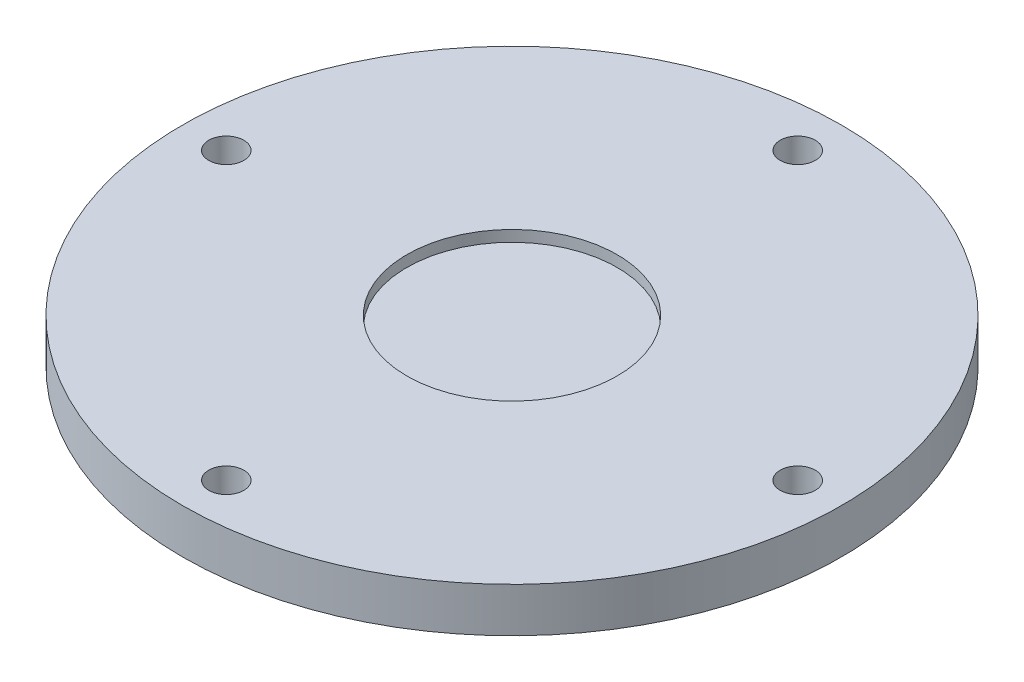
ISO-10303-21;
HEADER;
FILE_DESCRIPTION(('STEP AP214'),'2;1');
FILE_NAME('part.step','',(''),(''),'','','');
FILE_SCHEMA(('AUTOMOTIVE_DESIGN { 1 0 10303 214 1 1 1 1 }'));
ENDSEC;
DATA;
#1=APPLICATION_CONTEXT('core data for automotive mechanical design processes');
#2=APPLICATION_PROTOCOL_DEFINITION('international standard','automotive_design',2000,#1);
#3=PRODUCT_CONTEXT('',#1,'mechanical');
#4=PRODUCT('Part','Part','',(#3));
#5=PRODUCT_RELATED_PRODUCT_CATEGORY('part','',(#4));
#6=PRODUCT_DEFINITION_FORMATION('','',#4);
#7=PRODUCT_DEFINITION_CONTEXT('part definition',#1,'design');
#8=PRODUCT_DEFINITION('design','',#6,#7);
#9=PRODUCT_DEFINITION_SHAPE('','',#8);
#10=(LENGTH_UNIT() NAMED_UNIT(*) SI_UNIT(.MILLI.,.METRE.));
#11=(NAMED_UNIT(*) PLANE_ANGLE_UNIT() SI_UNIT($,.RADIAN.));
#12=(NAMED_UNIT(*) SI_UNIT($,.STERADIAN.) SOLID_ANGLE_UNIT());
#13=UNCERTAINTY_MEASURE_WITH_UNIT(LENGTH_MEASURE(1.E-05),#10,'distance_accuracy_value','');
#14=(GEOMETRIC_REPRESENTATION_CONTEXT(3) GLOBAL_UNCERTAINTY_ASSIGNED_CONTEXT((#13)) GLOBAL_UNIT_ASSIGNED_CONTEXT((#10,
#11,#12)) REPRESENTATION_CONTEXT('',''));
#15=CARTESIAN_POINT('',(0.,0.,0.));
#16=DIRECTION('',(0.,0.,1.));
#17=DIRECTION('',(1.,0.,0.));
#18=AXIS2_PLACEMENT_3D('',#15,#16,#17);
#19=CARTESIAN_POINT('',(0.,6.35000000000002,0.));
#20=DIRECTION('',(0.,1.,0.));
#21=DIRECTION('',(0.,0.,1.));
#22=AXIS2_PLACEMENT_3D('',#19,#20,#21);
#23=PLANE('',#22);
#24=CARTESIAN_POINT('',(0.,6.35000000000002,0.));
#25=DIRECTION('',(0.,1.,0.));
#26=DIRECTION('',(0.,0.,1.));
#27=AXIS2_PLACEMENT_3D('',#24,#25,#26);
#28=CIRCLE('',#27,15.);
#29=CARTESIAN_POINT('',(0.,6.35000000000002,15.));
#30=VERTEX_POINT('',#29);
#31=EDGE_CURVE('E91',#30,#30,#28,.T.);
#32=ORIENTED_EDGE('',*,*,#31,.F.);
#33=EDGE_LOOP('',(#32));
#34=FACE_BOUND('',#33,.T.);
#35=CARTESIAN_POINT('',(0.,6.35000000000002,40.75));
#36=DIRECTION('',(0.,1.,0.));
#37=DIRECTION('',(0.,0.,1.));
#38=AXIS2_PLACEMENT_3D('',#35,#36,#37);
#39=CIRCLE('',#38,2.50000000000001);
#40=CARTESIAN_POINT('',(0.,6.35000000000002,43.25));
#41=VERTEX_POINT('',#40);
#42=EDGE_CURVE('E71',#41,#41,#39,.T.);
#43=ORIENTED_EDGE('',*,*,#42,.F.);
#44=EDGE_LOOP('',(#43));
#45=FACE_BOUND('',#44,.T.);
#46=CARTESIAN_POINT('',(0.,6.34999999999986,-40.7500000000002));
#47=DIRECTION('',(0.,1.,0.));
#48=DIRECTION('',(0.,0.,1.));
#49=AXIS2_PLACEMENT_3D('',#46,#47,#48);
#50=CIRCLE('',#49,2.5);
#51=CARTESIAN_POINT('',(0.,6.34999999999986,-38.2500000000002));
#52=VERTEX_POINT('',#51);
#53=EDGE_CURVE('E57',#52,#52,#50,.T.);
#54=ORIENTED_EDGE('',*,*,#53,.F.);
#55=EDGE_LOOP('',(#54));
#56=FACE_BOUND('',#55,.T.);
#57=CARTESIAN_POINT('',(0.,6.35000000000002,0.));
#58=DIRECTION('',(0.,1.,0.));
#59=DIRECTION('',(0.,0.,1.));
#60=AXIS2_PLACEMENT_3D('',#57,#58,#59);
#61=CIRCLE('',#60,47.);
#62=CARTESIAN_POINT('',(0.,6.35000000000002,47.0000000000001));
#63=VERTEX_POINT('',#62);
#64=EDGE_CURVE('E10',#63,#63,#61,.T.);
#65=ORIENTED_EDGE('',*,*,#64,.T.);
#66=EDGE_LOOP('',(#65));
#67=FACE_BOUND('',#66,.T.);
#68=CARTESIAN_POINT('',(40.7500000000001,6.35000000000002,0.));
#69=DIRECTION('',(0.,1.,0.));
#70=DIRECTION('',(0.,0.,1.));
#71=AXIS2_PLACEMENT_3D('',#68,#69,#70);
#72=CIRCLE('',#71,2.50000000000234);
#73=CARTESIAN_POINT('',(40.7500000000001,6.35000000000002,2.50000000000234));
#74=VERTEX_POINT('',#73);
#75=EDGE_CURVE('E63',#74,#74,#72,.T.);
#76=ORIENTED_EDGE('',*,*,#75,.F.);
#77=EDGE_LOOP('',(#76));
#78=FACE_BOUND('',#77,.T.);
#79=CARTESIAN_POINT('',(-40.7500000000001,6.35000000000002,0.));
#80=DIRECTION('',(0.,1.,0.));
#81=DIRECTION('',(0.,0.,1.));
#82=AXIS2_PLACEMENT_3D('',#79,#80,#81);
#83=CIRCLE('',#82,2.50000000000377);
#84=CARTESIAN_POINT('',(-40.7500000000001,6.35000000000002,2.50000000000372));
#85=VERTEX_POINT('',#84);
#86=EDGE_CURVE('E79',#85,#85,#83,.T.);
#87=ORIENTED_EDGE('',*,*,#86,.F.);
#88=EDGE_LOOP('',(#87));
#89=FACE_BOUND('',#88,.T.);
#90=ADVANCED_FACE('F43',(#34,#45,#56,#67,#78,#89),#23,.T.);
#91=CARTESIAN_POINT('',(0.,0.,0.));
#92=DIRECTION('',(0.,1.,0.));
#93=DIRECTION('',(0.,0.,1.));
#94=AXIS2_PLACEMENT_3D('',#91,#92,#93);
#95=PLANE('',#94);
#96=CARTESIAN_POINT('',(0.,0.,0.));
#97=DIRECTION('',(0.,1.,0.));
#98=DIRECTION('',(0.,0.,1.));
#99=AXIS2_PLACEMENT_3D('',#96,#97,#98);
#100=CIRCLE('',#99,47.);
#101=CARTESIAN_POINT('',(0.,0.,47.0000000000001));
#102=VERTEX_POINT('',#101);
#103=EDGE_CURVE('E47',#102,#102,#100,.T.);
#104=ORIENTED_EDGE('',*,*,#103,.F.);
#105=EDGE_LOOP('',(#104));
#106=FACE_BOUND('',#105,.T.);
#107=CARTESIAN_POINT('',(0.,-1.66533453693773E-13,-40.7500000000002));
#108=DIRECTION('',(0.,1.,0.));
#109=DIRECTION('',(0.,0.,1.));
#110=AXIS2_PLACEMENT_3D('',#107,#108,#109);
#111=CIRCLE('',#110,2.5);
#112=CARTESIAN_POINT('',(0.,-1.6653345366514E-13,-38.2500000000002));
#113=VERTEX_POINT('',#112);
#114=EDGE_CURVE('E59',#113,#113,#111,.T.);
#115=ORIENTED_EDGE('',*,*,#114,.T.);
#116=EDGE_LOOP('',(#115));
#117=FACE_BOUND('',#116,.T.);
#118=CARTESIAN_POINT('',(40.7500000000001,0.,0.));
#119=DIRECTION('',(0.,1.,0.));
#120=DIRECTION('',(0.,0.,1.));
#121=AXIS2_PLACEMENT_3D('',#118,#119,#120);
#122=CIRCLE('',#121,2.50000000000234);
#123=CARTESIAN_POINT('',(40.7500000000001,0.,2.50000000000234));
#124=VERTEX_POINT('',#123);
#125=EDGE_CURVE('E67',#124,#124,#122,.T.);
#126=ORIENTED_EDGE('',*,*,#125,.T.);
#127=EDGE_LOOP('',(#126));
#128=FACE_BOUND('',#127,.T.);
#129=CARTESIAN_POINT('',(0.,0.,40.75));
#130=DIRECTION('',(0.,1.,0.));
#131=DIRECTION('',(0.,0.,1.));
#132=AXIS2_PLACEMENT_3D('',#129,#130,#131);
#133=CIRCLE('',#132,2.50000000000001);
#134=CARTESIAN_POINT('',(0.,0.,43.25));
#135=VERTEX_POINT('',#134);
#136=EDGE_CURVE('E75',#135,#135,#133,.T.);
#137=ORIENTED_EDGE('',*,*,#136,.T.);
#138=EDGE_LOOP('',(#137));
#139=FACE_BOUND('',#138,.T.);
#140=CARTESIAN_POINT('',(-40.7500000000001,0.,0.));
#141=DIRECTION('',(0.,1.,0.));
#142=DIRECTION('',(0.,0.,1.));
#143=AXIS2_PLACEMENT_3D('',#140,#141,#142);
#144=CIRCLE('',#143,2.50000000000377);
#145=CARTESIAN_POINT('',(-40.7500000000001,0.,2.50000000000372));
#146=VERTEX_POINT('',#145);
#147=EDGE_CURVE('E83',#146,#146,#144,.T.);
#148=ORIENTED_EDGE('',*,*,#147,.T.);
#149=EDGE_LOOP('',(#148));
#150=FACE_BOUND('',#149,.T.);
#151=ADVANCED_FACE('F111',(#106,#117,#128,#139,#150),#95,.F.);
#152=CARTESIAN_POINT('',(0.,6.35000000000002,0.));
#153=DIRECTION('',(0.,-1.,0.));
#154=DIRECTION('',(0.,0.,-1.));
#155=AXIS2_PLACEMENT_3D('',#152,#153,#154);
#156=CYLINDRICAL_SURFACE('',#155,47.);
#157=ORIENTED_EDGE('',*,*,#64,.F.);
#158=EDGE_LOOP('',(#157));
#159=FACE_BOUND('',#158,.T.);
#160=ORIENTED_EDGE('',*,*,#103,.T.);
#161=EDGE_LOOP('',(#160));
#162=FACE_BOUND('',#161,.T.);
#163=ADVANCED_FACE('F45',(#159,#162),#156,.T.);
#164=CARTESIAN_POINT('',(0.,6.34999999999986,-40.7500000000002));
#165=DIRECTION('',(0.,-1.,0.));
#166=DIRECTION('',(0.,0.,-1.));
#167=AXIS2_PLACEMENT_3D('',#164,#165,#166);
#168=CYLINDRICAL_SURFACE('',#167,2.5);
#169=ORIENTED_EDGE('',*,*,#53,.T.);
#170=EDGE_LOOP('',(#169));
#171=FACE_BOUND('',#170,.T.);
#172=ORIENTED_EDGE('',*,*,#114,.F.);
#173=EDGE_LOOP('',(#172));
#174=FACE_BOUND('',#173,.T.);
#175=ADVANCED_FACE('F132',(#171,#174),#168,.F.);
#176=CARTESIAN_POINT('',(40.7500000000001,6.35000000000002,0.));
#177=DIRECTION('',(0.,-1.,0.));
#178=DIRECTION('',(0.,0.,-1.));
#179=AXIS2_PLACEMENT_3D('',#176,#177,#178);
#180=CYLINDRICAL_SURFACE('',#179,2.50000000000234);
#181=ORIENTED_EDGE('',*,*,#75,.T.);
#182=EDGE_LOOP('',(#181));
#183=FACE_BOUND('',#182,.T.);
#184=ORIENTED_EDGE('',*,*,#125,.F.);
#185=EDGE_LOOP('',(#184));
#186=FACE_BOUND('',#185,.T.);
#187=ADVANCED_FACE('F139',(#183,#186),#180,.F.);
#188=CARTESIAN_POINT('',(0.,6.35000000000002,40.75));
#189=DIRECTION('',(0.,-1.,0.));
#190=DIRECTION('',(0.,0.,-1.));
#191=AXIS2_PLACEMENT_3D('',#188,#189,#190);
#192=CYLINDRICAL_SURFACE('',#191,2.50000000000001);
#193=ORIENTED_EDGE('',*,*,#42,.T.);
#194=EDGE_LOOP('',(#193));
#195=FACE_BOUND('',#194,.T.);
#196=ORIENTED_EDGE('',*,*,#136,.F.);
#197=EDGE_LOOP('',(#196));
#198=FACE_BOUND('',#197,.T.);
#199=ADVANCED_FACE('F123',(#195,#198),#192,.F.);
#200=CARTESIAN_POINT('',(-40.7500000000001,6.35000000000002,0.));
#201=DIRECTION('',(0.,-1.,0.));
#202=DIRECTION('',(0.,0.,-1.));
#203=AXIS2_PLACEMENT_3D('',#200,#201,#202);
#204=CYLINDRICAL_SURFACE('',#203,2.50000000000377);
#205=ORIENTED_EDGE('',*,*,#86,.T.);
#206=EDGE_LOOP('',(#205));
#207=FACE_BOUND('',#206,.T.);
#208=ORIENTED_EDGE('',*,*,#147,.F.);
#209=EDGE_LOOP('',(#208));
#210=FACE_BOUND('',#209,.T.);
#211=ADVANCED_FACE('F105',(#207,#210),#204,.F.);
#212=CARTESIAN_POINT('',(0.,4.7625,0.));
#213=DIRECTION('',(0.,1.,0.));
#214=DIRECTION('',(0.,0.,1.));
#215=AXIS2_PLACEMENT_3D('',#212,#213,#214);
#216=CYLINDRICAL_SURFACE('',#215,15.);
#217=CARTESIAN_POINT('',(0.,4.7625,0.));
#218=DIRECTION('',(0.,1.,0.));
#219=DIRECTION('',(0.,0.,1.));
#220=AXIS2_PLACEMENT_3D('',#217,#218,#219);
#221=CIRCLE('',#220,15.);
#222=CARTESIAN_POINT('',(0.,4.7625,15.));
#223=VERTEX_POINT('',#222);
#224=EDGE_CURVE('E87',#223,#223,#221,.T.);
#225=ORIENTED_EDGE('',*,*,#224,.F.);
#226=EDGE_LOOP('',(#225));
#227=FACE_BOUND('',#226,.T.);
#228=ORIENTED_EDGE('',*,*,#31,.T.);
#229=EDGE_LOOP('',(#228));
#230=FACE_BOUND('',#229,.T.);
#231=ADVANCED_FACE('F102',(#227,#230),#216,.F.);
#232=CARTESIAN_POINT('',(0.,4.7625,0.));
#233=DIRECTION('',(0.,1.,0.));
#234=DIRECTION('',(0.,0.,1.));
#235=AXIS2_PLACEMENT_3D('',#232,#233,#234);
#236=PLANE('',#235);
#237=ORIENTED_EDGE('',*,*,#224,.T.);
#238=EDGE_LOOP('',(#237));
#239=FACE_BOUND('',#238,.T.);
#240=ADVANCED_FACE('F100',(#239),#236,.T.);
#241=CLOSED_SHELL('',(#90,#151,#163,#175,#187,#199,#211,#231,#240));
#242=MANIFOLD_SOLID_BREP('B2',#241);
#243=ADVANCED_BREP_SHAPE_REPRESENTATION('',(#18,#242),#14);
#244=SHAPE_DEFINITION_REPRESENTATION(#9,#243);
ENDSEC;
END-ISO-10303-21;
